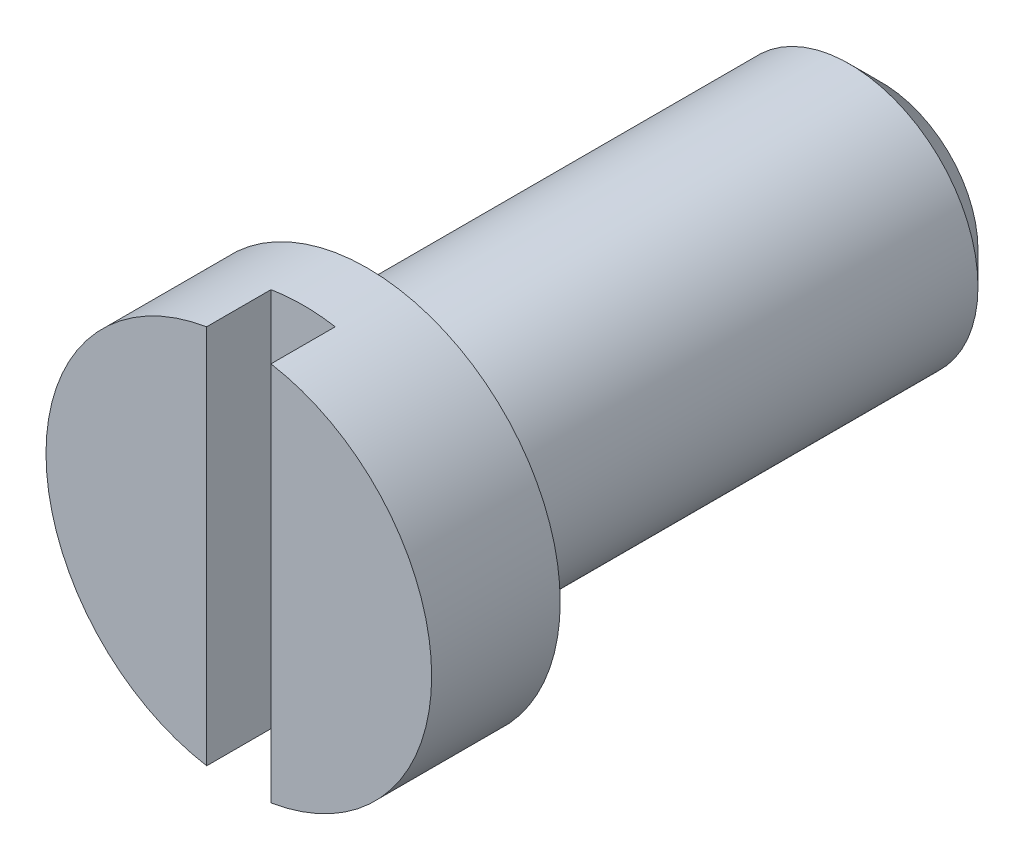
ISO-10303-21;
HEADER;
FILE_DESCRIPTION(('STEP AP214'),'2;1');
FILE_NAME('part.step','',(''),(''),'','','');
FILE_SCHEMA(('AUTOMOTIVE_DESIGN { 1 0 10303 214 1 1 1 1 }'));
ENDSEC;
DATA;
#1=APPLICATION_CONTEXT('core data for automotive mechanical design processes');
#2=APPLICATION_PROTOCOL_DEFINITION('international standard','automotive_design',2000,#1);
#3=PRODUCT_CONTEXT('',#1,'mechanical');
#4=PRODUCT('Part','Part','',(#3));
#5=PRODUCT_RELATED_PRODUCT_CATEGORY('part','',(#4));
#6=PRODUCT_DEFINITION_FORMATION('','',#4);
#7=PRODUCT_DEFINITION_CONTEXT('part definition',#1,'design');
#8=PRODUCT_DEFINITION('design','',#6,#7);
#9=PRODUCT_DEFINITION_SHAPE('','',#8);
#10=(LENGTH_UNIT() NAMED_UNIT(*) SI_UNIT(.MILLI.,.METRE.));
#11=(NAMED_UNIT(*) PLANE_ANGLE_UNIT() SI_UNIT($,.RADIAN.));
#12=(NAMED_UNIT(*) SI_UNIT($,.STERADIAN.) SOLID_ANGLE_UNIT());
#13=UNCERTAINTY_MEASURE_WITH_UNIT(LENGTH_MEASURE(1.E-05),#10,'distance_accuracy_value','');
#14=(GEOMETRIC_REPRESENTATION_CONTEXT(3) GLOBAL_UNCERTAINTY_ASSIGNED_CONTEXT((#13)) GLOBAL_UNIT_ASSIGNED_CONTEXT((#10,
#11,#12)) REPRESENTATION_CONTEXT('',''));
#15=CARTESIAN_POINT('',(0.,0.,0.));
#16=DIRECTION('',(0.,0.,1.));
#17=DIRECTION('',(1.,0.,0.));
#18=AXIS2_PLACEMENT_3D('',#15,#16,#17);
#19=CARTESIAN_POINT('',(0.,0.,0.25));
#20=DIRECTION('',(0.,0.,1.));
#21=DIRECTION('',(1.,0.,0.));
#22=AXIS2_PLACEMENT_3D('',#19,#20,#21);
#23=CONICAL_SURFACE('',#22,1.,0.785398163397449);
#24=CARTESIAN_POINT('',(0.,0.,0.25));
#25=DIRECTION('',(0.,0.,1.));
#26=DIRECTION('',(-1.,0.,0.));
#27=AXIS2_PLACEMENT_3D('',#24,#25,#26);
#28=CIRCLE('',#27,1.);
#29=CARTESIAN_POINT('',(-1.,0.,0.25));
#30=VERTEX_POINT('',#29);
#31=EDGE_CURVE('E115',#30,#30,#28,.T.);
#32=ORIENTED_EDGE('',*,*,#31,.F.);
#33=EDGE_LOOP('',(#32));
#34=FACE_BOUND('',#33,.T.);
#35=CARTESIAN_POINT('',(0.,0.,0.));
#36=DIRECTION('',(0.,0.,-1.));
#37=DIRECTION('',(-1.,0.,0.));
#38=AXIS2_PLACEMENT_3D('',#35,#36,#37);
#39=CIRCLE('',#38,0.75);
#40=CARTESIAN_POINT('',(-0.75,0.,0.));
#41=VERTEX_POINT('',#40);
#42=EDGE_CURVE('E113',#41,#41,#39,.T.);
#43=ORIENTED_EDGE('',*,*,#42,.F.);
#44=EDGE_LOOP('',(#43));
#45=FACE_BOUND('',#44,.T.);
#46=ADVANCED_FACE('F16',(#34,#45),#23,.T.);
#47=CARTESIAN_POINT('',(0.,0.,4.5));
#48=DIRECTION('',(0.,0.,1.));
#49=DIRECTION('',(1.,0.,0.));
#50=AXIS2_PLACEMENT_3D('',#47,#48,#49);
#51=PLANE('',#50);
#52=DIRECTION('',(0.,-1.,0.));
#53=VECTOR('',#52,1.);
#54=CARTESIAN_POINT('',(0.25,0.,4.5));
#55=LINE('',#54,#53);
#56=CARTESIAN_POINT('',(0.25,1.4790199457749,4.5));
#57=VERTEX_POINT('',#56);
#58=CARTESIAN_POINT('',(0.25,-1.4790199457749,4.5));
#59=VERTEX_POINT('',#58);
#60=EDGE_CURVE('E27',#57,#59,#55,.T.);
#61=ORIENTED_EDGE('',*,*,#60,.F.);
#62=CARTESIAN_POINT('',(0.,0.,4.5));
#63=DIRECTION('',(0.,0.,-1.));
#64=DIRECTION('',(1.,0.,0.));
#65=AXIS2_PLACEMENT_3D('',#62,#63,#64);
#66=CIRCLE('',#65,1.5);
#67=CARTESIAN_POINT('',(-0.25,1.4790199457749,4.5));
#68=VERTEX_POINT('',#67);
#69=EDGE_CURVE('E20',#68,#57,#66,.T.);
#70=ORIENTED_EDGE('',*,*,#69,.F.);
#71=DIRECTION('',(0.,-1.,0.));
#72=VECTOR('',#71,1.);
#73=CARTESIAN_POINT('',(-0.25,0.,4.5));
#74=LINE('',#73,#72);
#75=CARTESIAN_POINT('',(-0.25,-1.4790199457749,4.5));
#76=VERTEX_POINT('',#75);
#77=EDGE_CURVE('E11',#68,#76,#74,.T.);
#78=ORIENTED_EDGE('',*,*,#77,.T.);
#79=CARTESIAN_POINT('',(0.,0.,4.5));
#80=DIRECTION('',(0.,0.,-1.));
#81=DIRECTION('',(1.,0.,0.));
#82=AXIS2_PLACEMENT_3D('',#79,#80,#81);
#83=CIRCLE('',#82,1.5);
#84=EDGE_CURVE('E90',#59,#76,#83,.T.);
#85=ORIENTED_EDGE('',*,*,#84,.F.);
#86=EDGE_LOOP('',(#61,#70,#78,#85));
#87=FACE_BOUND('',#86,.T.);
#88=ADVANCED_FACE('F91',(#87),#51,.T.);
#89=CARTESIAN_POINT('',(-0.25,0.,4.5));
#90=DIRECTION('',(-1.,0.,0.));
#91=DIRECTION('',(0.,0.,1.));
#92=AXIS2_PLACEMENT_3D('',#89,#90,#91);
#93=PLANE('',#92);
#94=DIRECTION('',(0.,0.,-1.));
#95=VECTOR('',#94,1.);
#96=CARTESIAN_POINT('',(-0.25,-1.4790199457749,-2.5));
#97=LINE('',#96,#95);
#98=CARTESIAN_POINT('',(-0.25,-1.4790199457749,5.));
#99=VERTEX_POINT('',#98);
#100=EDGE_CURVE('E96',#99,#76,#97,.T.);
#101=ORIENTED_EDGE('',*,*,#100,.T.);
#102=ORIENTED_EDGE('',*,*,#77,.F.);
#103=DIRECTION('',(0.,0.,1.));
#104=VECTOR('',#103,1.);
#105=CARTESIAN_POINT('',(-0.25,1.4790199457749,-2.5));
#106=LINE('',#105,#104);
#107=CARTESIAN_POINT('',(-0.25,1.4790199457749,5.));
#108=VERTEX_POINT('',#107);
#109=EDGE_CURVE('E123',#68,#108,#106,.T.);
#110=ORIENTED_EDGE('',*,*,#109,.T.);
#111=DIRECTION('',(0.,-1.,0.));
#112=VECTOR('',#111,1.);
#113=CARTESIAN_POINT('',(-0.25,0.,5.));
#114=LINE('',#113,#112);
#115=EDGE_CURVE('E87',#108,#99,#114,.T.);
#116=ORIENTED_EDGE('',*,*,#115,.T.);
#117=EDGE_LOOP('',(#101,#102,#110,#116));
#118=FACE_BOUND('',#117,.T.);
#119=ADVANCED_FACE('F134',(#118),#93,.F.);
#120=CARTESIAN_POINT('',(0.25,0.,4.5));
#121=DIRECTION('',(-1.,0.,0.));
#122=DIRECTION('',(0.,0.,1.));
#123=AXIS2_PLACEMENT_3D('',#120,#121,#122);
#124=PLANE('',#123);
#125=DIRECTION('',(0.,-1.,0.));
#126=VECTOR('',#125,1.);
#127=CARTESIAN_POINT('',(0.25,0.,5.));
#128=LINE('',#127,#126);
#129=CARTESIAN_POINT('',(0.25,1.4790199457749,5.));
#130=VERTEX_POINT('',#129);
#131=CARTESIAN_POINT('',(0.25,-1.4790199457749,5.));
#132=VERTEX_POINT('',#131);
#133=EDGE_CURVE('E73',#130,#132,#128,.T.);
#134=ORIENTED_EDGE('',*,*,#133,.F.);
#135=DIRECTION('',(0.,0.,1.));
#136=VECTOR('',#135,1.);
#137=CARTESIAN_POINT('',(0.25,1.4790199457749,-2.5));
#138=LINE('',#137,#136);
#139=EDGE_CURVE('E82',#57,#130,#138,.T.);
#140=ORIENTED_EDGE('',*,*,#139,.F.);
#141=ORIENTED_EDGE('',*,*,#60,.T.);
#142=DIRECTION('',(0.,0.,-1.));
#143=VECTOR('',#142,1.);
#144=CARTESIAN_POINT('',(0.25,-1.4790199457749,-2.5));
#145=LINE('',#144,#143);
#146=EDGE_CURVE('E80',#132,#59,#145,.T.);
#147=ORIENTED_EDGE('',*,*,#146,.F.);
#148=EDGE_LOOP('',(#134,#140,#141,#147));
#149=FACE_BOUND('',#148,.T.);
#150=ADVANCED_FACE('F18',(#149),#124,.T.);
#151=CARTESIAN_POINT('',(0.75,0.,5.));
#152=DIRECTION('',(0.,0.,1.));
#153=DIRECTION('',(1.,0.,0.));
#154=AXIS2_PLACEMENT_3D('',#151,#152,#153);
#155=PLANE('',#154);
#156=ORIENTED_EDGE('',*,*,#115,.F.);
#157=CARTESIAN_POINT('',(0.,0.,5.));
#158=DIRECTION('',(0.,0.,1.));
#159=DIRECTION('',(1.,0.,0.));
#160=AXIS2_PLACEMENT_3D('',#157,#158,#159);
#161=CIRCLE('',#160,1.5);
#162=EDGE_CURVE('E119',#108,#99,#161,.T.);
#163=ORIENTED_EDGE('',*,*,#162,.T.);
#164=EDGE_LOOP('',(#156,#163));
#165=FACE_BOUND('',#164,.T.);
#166=ADVANCED_FACE('F142',(#165),#155,.T.);
#167=CARTESIAN_POINT('',(1.25,0.,4.));
#168=DIRECTION('',(0.,0.,-1.));
#169=DIRECTION('',(0.,-1.,0.));
#170=AXIS2_PLACEMENT_3D('',#167,#168,#169);
#171=PLANE('',#170);
#172=CARTESIAN_POINT('',(0.,0.,4.));
#173=DIRECTION('',(0.,0.,1.));
#174=DIRECTION('',(1.,0.,0.));
#175=AXIS2_PLACEMENT_3D('',#172,#173,#174);
#176=CIRCLE('',#175,1.5);
#177=CARTESIAN_POINT('',(1.5,0.,4.));
#178=VERTEX_POINT('',#177);
#179=EDGE_CURVE('E108',#178,#178,#176,.T.);
#180=ORIENTED_EDGE('',*,*,#179,.F.);
#181=EDGE_LOOP('',(#180));
#182=FACE_BOUND('',#181,.T.);
#183=CARTESIAN_POINT('',(0.,0.,4.));
#184=DIRECTION('',(0.,0.,1.));
#185=DIRECTION('',(1.,0.,0.));
#186=AXIS2_PLACEMENT_3D('',#183,#184,#185);
#187=CIRCLE('',#186,1.);
#188=CARTESIAN_POINT('',(1.,0.,4.));
#189=VERTEX_POINT('',#188);
#190=EDGE_CURVE('E39',#189,#189,#187,.T.);
#191=ORIENTED_EDGE('',*,*,#190,.T.);
#192=EDGE_LOOP('',(#191));
#193=FACE_BOUND('',#192,.T.);
#194=ADVANCED_FACE('F211',(#182,#193),#171,.T.);
#195=CARTESIAN_POINT('',(0.,0.,-2.5));
#196=DIRECTION('',(0.,0.,1.));
#197=DIRECTION('',(1.,0.,0.));
#198=AXIS2_PLACEMENT_3D('',#195,#196,#197);
#199=CYLINDRICAL_SURFACE('',#198,1.);
#200=ORIENTED_EDGE('',*,*,#190,.F.);
#201=EDGE_LOOP('',(#200));
#202=FACE_BOUND('',#201,.T.);
#203=ORIENTED_EDGE('',*,*,#31,.T.);
#204=EDGE_LOOP('',(#203));
#205=FACE_BOUND('',#204,.T.);
#206=ADVANCED_FACE('F199',(#202,#205),#199,.T.);
#207=CARTESIAN_POINT('',(0.5,0.,0.));
#208=DIRECTION('',(0.,0.,-1.));
#209=DIRECTION('',(0.,-1.,0.));
#210=AXIS2_PLACEMENT_3D('',#207,#208,#209);
#211=PLANE('',#210);
#212=ORIENTED_EDGE('',*,*,#42,.T.);
#213=EDGE_LOOP('',(#212));
#214=FACE_BOUND('',#213,.T.);
#215=ADVANCED_FACE('F187',(#214),#211,.T.);
#216=CARTESIAN_POINT('',(0.75,0.,5.));
#217=DIRECTION('',(0.,0.,1.));
#218=DIRECTION('',(1.,0.,0.));
#219=AXIS2_PLACEMENT_3D('',#216,#217,#218);
#220=PLANE('',#219);
#221=CARTESIAN_POINT('',(0.,0.,5.));
#222=DIRECTION('',(0.,0.,1.));
#223=DIRECTION('',(1.,0.,0.));
#224=AXIS2_PLACEMENT_3D('',#221,#222,#223);
#225=CIRCLE('',#224,1.5);
#226=EDGE_CURVE('E101',#132,#130,#225,.T.);
#227=ORIENTED_EDGE('',*,*,#226,.T.);
#228=ORIENTED_EDGE('',*,*,#133,.T.);
#229=EDGE_LOOP('',(#227,#228));
#230=FACE_BOUND('',#229,.T.);
#231=ADVANCED_FACE('F175',(#230),#220,.T.);
#232=CARTESIAN_POINT('',(0.,0.,-2.5));
#233=DIRECTION('',(0.,0.,1.));
#234=DIRECTION('',(1.,0.,0.));
#235=AXIS2_PLACEMENT_3D('',#232,#233,#234);
#236=CYLINDRICAL_SURFACE('',#235,1.5);
#237=ORIENTED_EDGE('',*,*,#226,.F.);
#238=ORIENTED_EDGE('',*,*,#146,.T.);
#239=ORIENTED_EDGE('',*,*,#84,.T.);
#240=ORIENTED_EDGE('',*,*,#100,.F.);
#241=ORIENTED_EDGE('',*,*,#162,.F.);
#242=ORIENTED_EDGE('',*,*,#109,.F.);
#243=ORIENTED_EDGE('',*,*,#69,.T.);
#244=ORIENTED_EDGE('',*,*,#139,.T.);
#245=EDGE_LOOP('',(#237,#238,#239,#240,#241,#242,#243,#244));
#246=FACE_BOUND('',#245,.T.);
#247=ORIENTED_EDGE('',*,*,#179,.T.);
#248=EDGE_LOOP('',(#247));
#249=FACE_BOUND('',#248,.T.);
#250=ADVANCED_FACE('F98',(#246,#249),#236,.T.);
#251=CLOSED_SHELL('',(#46,#88,#119,#150,#166,#194,#206,#215,#231,#250));
#252=MANIFOLD_SOLID_BREP('B1',#251);
#253=ADVANCED_BREP_SHAPE_REPRESENTATION('',(#18,#252),#14);
#254=SHAPE_DEFINITION_REPRESENTATION(#9,#253);
ENDSEC;
END-ISO-10303-21;
